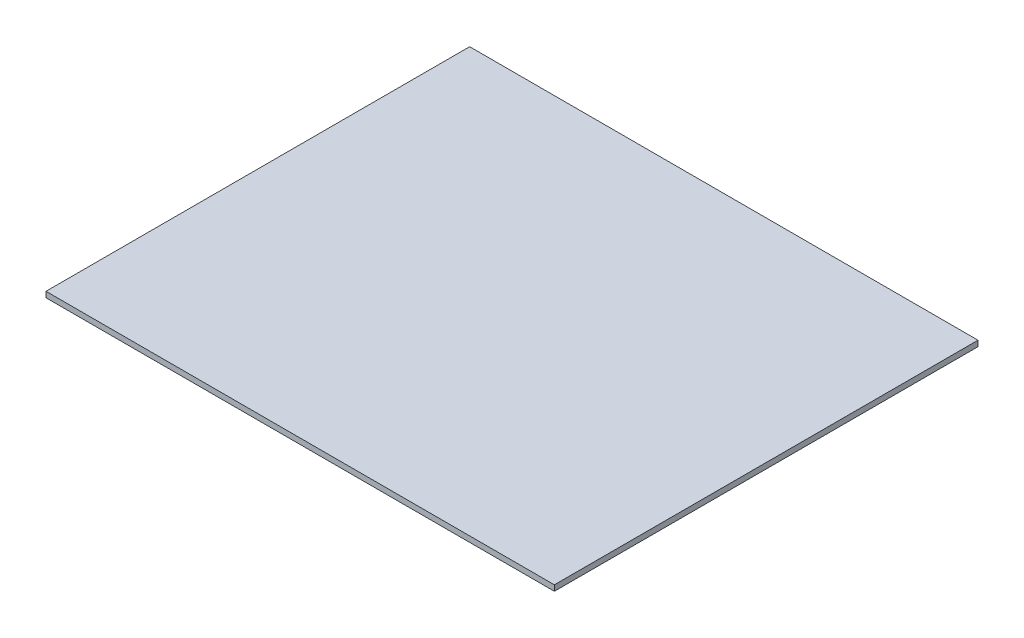
ISO-10303-21;
HEADER;
FILE_DESCRIPTION(('STEP AP214'),'2;1');
FILE_NAME('part.step','',(''),(''),'','','');
FILE_SCHEMA(('AUTOMOTIVE_DESIGN { 1 0 10303 214 1 1 1 1 }'));
ENDSEC;
DATA;
#1=APPLICATION_CONTEXT('core data for automotive mechanical design processes');
#2=APPLICATION_PROTOCOL_DEFINITION('international standard','automotive_design',2000,#1);
#3=PRODUCT_CONTEXT('',#1,'mechanical');
#4=PRODUCT('Part','Part','',(#3));
#5=PRODUCT_RELATED_PRODUCT_CATEGORY('part','',(#4));
#6=PRODUCT_DEFINITION_FORMATION('','',#4);
#7=PRODUCT_DEFINITION_CONTEXT('part definition',#1,'design');
#8=PRODUCT_DEFINITION('design','',#6,#7);
#9=PRODUCT_DEFINITION_SHAPE('','',#8);
#10=(LENGTH_UNIT() NAMED_UNIT(*) SI_UNIT(.MILLI.,.METRE.));
#11=(NAMED_UNIT(*) PLANE_ANGLE_UNIT() SI_UNIT($,.RADIAN.));
#12=(NAMED_UNIT(*) SI_UNIT($,.STERADIAN.) SOLID_ANGLE_UNIT());
#13=UNCERTAINTY_MEASURE_WITH_UNIT(LENGTH_MEASURE(1.E-05),#10,'distance_accuracy_value','');
#14=(GEOMETRIC_REPRESENTATION_CONTEXT(3) GLOBAL_UNCERTAINTY_ASSIGNED_CONTEXT((#13)) GLOBAL_UNIT_ASSIGNED_CONTEXT((#10,
#11,#12)) REPRESENTATION_CONTEXT('',''));
#15=CARTESIAN_POINT('',(0.,0.,0.));
#16=DIRECTION('',(0.,0.,1.));
#17=DIRECTION('',(1.,0.,0.));
#18=AXIS2_PLACEMENT_3D('',#15,#16,#17);
#19=CARTESIAN_POINT('',(0.,4.,300.));
#20=DIRECTION('',(1.,0.,0.));
#21=DIRECTION('',(0.,0.,-1.));
#22=AXIS2_PLACEMENT_3D('',#19,#20,#21);
#23=PLANE('',#22);
#24=DIRECTION('',(0.,0.,1.));
#25=VECTOR('',#24,1.);
#26=CARTESIAN_POINT('',(0.,0.,300.));
#27=LINE('',#26,#25);
#28=CARTESIAN_POINT('',(0.,0.,0.));
#29=VERTEX_POINT('',#28);
#30=CARTESIAN_POINT('',(0.,0.,300.));
#31=VERTEX_POINT('',#30);
#32=EDGE_CURVE('E102',#29,#31,#27,.T.);
#33=ORIENTED_EDGE('',*,*,#32,.T.);
#34=DIRECTION('',(0.,-1.,0.));
#35=VECTOR('',#34,1.);
#36=CARTESIAN_POINT('',(0.,4.,300.));
#37=LINE('',#36,#35);
#38=CARTESIAN_POINT('',(0.,4.,300.));
#39=VERTEX_POINT('',#38);
#40=EDGE_CURVE('E11',#39,#31,#37,.T.);
#41=ORIENTED_EDGE('',*,*,#40,.F.);
#42=DIRECTION('',(0.,0.,1.));
#43=VECTOR('',#42,1.);
#44=CARTESIAN_POINT('',(0.,4.,300.));
#45=LINE('',#44,#43);
#46=CARTESIAN_POINT('',(0.,4.,0.));
#47=VERTEX_POINT('',#46);
#48=EDGE_CURVE('E90',#47,#39,#45,.T.);
#49=ORIENTED_EDGE('',*,*,#48,.F.);
#50=DIRECTION('',(0.,-1.,0.));
#51=VECTOR('',#50,1.);
#52=CARTESIAN_POINT('',(0.,4.,0.));
#53=LINE('',#52,#51);
#54=EDGE_CURVE('E98',#47,#29,#53,.T.);
#55=ORIENTED_EDGE('',*,*,#54,.T.);
#56=EDGE_LOOP('',(#33,#41,#49,#55));
#57=FACE_BOUND('',#56,.T.);
#58=ADVANCED_FACE('F39',(#57),#23,.F.);
#59=CARTESIAN_POINT('',(360.,4.,300.));
#60=DIRECTION('',(0.,0.,-1.));
#61=DIRECTION('',(-1.,0.,0.));
#62=AXIS2_PLACEMENT_3D('',#59,#60,#61);
#63=PLANE('',#62);
#64=DIRECTION('',(1.,0.,0.));
#65=VECTOR('',#64,1.);
#66=CARTESIAN_POINT('',(360.,0.,300.));
#67=LINE('',#66,#65);
#68=CARTESIAN_POINT('',(360.,0.,300.));
#69=VERTEX_POINT('',#68);
#70=EDGE_CURVE('E94',#31,#69,#67,.T.);
#71=ORIENTED_EDGE('',*,*,#70,.T.);
#72=DIRECTION('',(0.,-1.,0.));
#73=VECTOR('',#72,1.);
#74=CARTESIAN_POINT('',(360.,4.,300.));
#75=LINE('',#74,#73);
#76=CARTESIAN_POINT('',(360.,4.,300.));
#77=VERTEX_POINT('',#76);
#78=EDGE_CURVE('E47',#77,#69,#75,.T.);
#79=ORIENTED_EDGE('',*,*,#78,.F.);
#80=DIRECTION('',(1.,0.,0.));
#81=VECTOR('',#80,1.);
#82=CARTESIAN_POINT('',(360.,4.,300.));
#83=LINE('',#82,#81);
#84=EDGE_CURVE('E85',#39,#77,#83,.T.);
#85=ORIENTED_EDGE('',*,*,#84,.F.);
#86=ORIENTED_EDGE('',*,*,#40,.T.);
#87=EDGE_LOOP('',(#71,#79,#85,#86));
#88=FACE_BOUND('',#87,.T.);
#89=ADVANCED_FACE('F93',(#88),#63,.F.);
#90=CARTESIAN_POINT('',(360.,4.,0.));
#91=DIRECTION('',(-1.,0.,0.));
#92=DIRECTION('',(0.,0.,1.));
#93=AXIS2_PLACEMENT_3D('',#90,#91,#92);
#94=PLANE('',#93);
#95=DIRECTION('',(0.,0.,-1.));
#96=VECTOR('',#95,1.);
#97=CARTESIAN_POINT('',(360.,0.,0.));
#98=LINE('',#97,#96);
#99=CARTESIAN_POINT('',(360.,0.,0.));
#100=VERTEX_POINT('',#99);
#101=EDGE_CURVE('E72',#69,#100,#98,.T.);
#102=ORIENTED_EDGE('',*,*,#101,.T.);
#103=DIRECTION('',(0.,-1.,0.));
#104=VECTOR('',#103,1.);
#105=CARTESIAN_POINT('',(360.,4.,0.));
#106=LINE('',#105,#104);
#107=CARTESIAN_POINT('',(360.,4.,0.));
#108=VERTEX_POINT('',#107);
#109=EDGE_CURVE('E95',#108,#100,#106,.T.);
#110=ORIENTED_EDGE('',*,*,#109,.F.);
#111=DIRECTION('',(0.,0.,-1.));
#112=VECTOR('',#111,1.);
#113=CARTESIAN_POINT('',(360.,4.,0.));
#114=LINE('',#113,#112);
#115=EDGE_CURVE('E88',#77,#108,#114,.T.);
#116=ORIENTED_EDGE('',*,*,#115,.F.);
#117=ORIENTED_EDGE('',*,*,#78,.T.);
#118=EDGE_LOOP('',(#102,#110,#116,#117));
#119=FACE_BOUND('',#118,.T.);
#120=ADVANCED_FACE('F96',(#119),#94,.F.);
#121=CARTESIAN_POINT('',(0.,4.,0.));
#122=DIRECTION('',(0.,0.,1.));
#123=DIRECTION('',(1.,0.,0.));
#124=AXIS2_PLACEMENT_3D('',#121,#122,#123);
#125=PLANE('',#124);
#126=DIRECTION('',(-1.,0.,0.));
#127=VECTOR('',#126,1.);
#128=CARTESIAN_POINT('',(0.,0.,0.));
#129=LINE('',#128,#127);
#130=EDGE_CURVE('E78',#100,#29,#129,.T.);
#131=ORIENTED_EDGE('',*,*,#130,.T.);
#132=ORIENTED_EDGE('',*,*,#54,.F.);
#133=DIRECTION('',(-1.,0.,0.));
#134=VECTOR('',#133,1.);
#135=CARTESIAN_POINT('',(0.,4.,0.));
#136=LINE('',#135,#134);
#137=EDGE_CURVE('E55',#108,#47,#136,.T.);
#138=ORIENTED_EDGE('',*,*,#137,.F.);
#139=ORIENTED_EDGE('',*,*,#109,.T.);
#140=EDGE_LOOP('',(#131,#132,#138,#139));
#141=FACE_BOUND('',#140,.T.);
#142=ADVANCED_FACE('F109',(#141),#125,.F.);
#143=CARTESIAN_POINT('',(0.,4.,0.));
#144=DIRECTION('',(0.,-1.,0.));
#145=DIRECTION('',(0.,0.,-1.));
#146=AXIS2_PLACEMENT_3D('',#143,#144,#145);
#147=PLANE('',#146);
#148=ORIENTED_EDGE('',*,*,#48,.T.);
#149=ORIENTED_EDGE('',*,*,#84,.T.);
#150=ORIENTED_EDGE('',*,*,#115,.T.);
#151=ORIENTED_EDGE('',*,*,#137,.T.);
#152=EDGE_LOOP('',(#148,#149,#150,#151));
#153=FACE_BOUND('',#152,.T.);
#154=ADVANCED_FACE('F86',(#153),#147,.F.);
#155=CARTESIAN_POINT('',(0.,0.,0.));
#156=DIRECTION('',(0.,-1.,0.));
#157=DIRECTION('',(0.,0.,-1.));
#158=AXIS2_PLACEMENT_3D('',#155,#156,#157);
#159=PLANE('',#158);
#160=ORIENTED_EDGE('',*,*,#32,.F.);
#161=ORIENTED_EDGE('',*,*,#130,.F.);
#162=ORIENTED_EDGE('',*,*,#101,.F.);
#163=ORIENTED_EDGE('',*,*,#70,.F.);
#164=EDGE_LOOP('',(#160,#161,#162,#163));
#165=FACE_BOUND('',#164,.T.);
#166=ADVANCED_FACE('F112',(#165),#159,.T.);
#167=CLOSED_SHELL('',(#58,#89,#120,#142,#154,#166));
#168=MANIFOLD_SOLID_BREP('B2',#167);
#169=ADVANCED_BREP_SHAPE_REPRESENTATION('',(#18,#168),#14);
#170=SHAPE_DEFINITION_REPRESENTATION(#9,#169);
ENDSEC;
END-ISO-10303-21;
